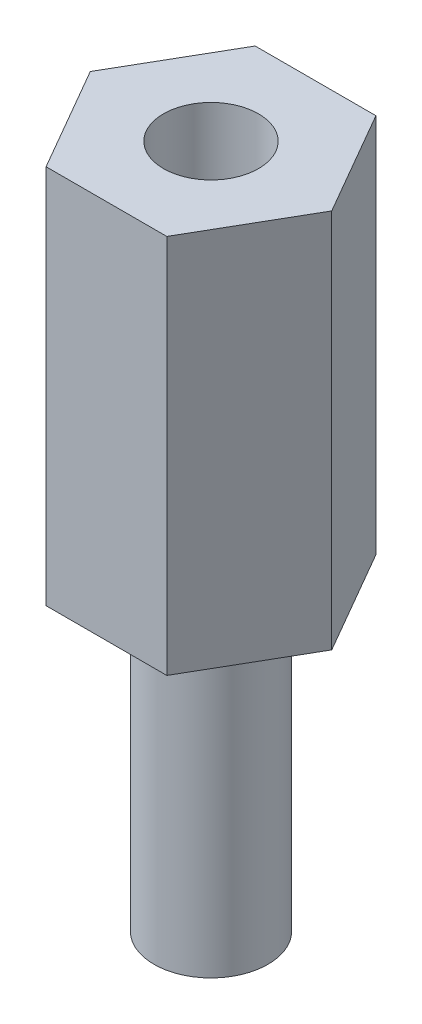
ISO-10303-21;
HEADER;
FILE_DESCRIPTION(('STEP AP214'),'2;1');
FILE_NAME('part.step','',(''),(''),'','','');
FILE_SCHEMA(('AUTOMOTIVE_DESIGN { 1 0 10303 214 1 1 1 1 }'));
ENDSEC;
DATA;
#1=APPLICATION_CONTEXT('core data for automotive mechanical design processes');
#2=APPLICATION_PROTOCOL_DEFINITION('international standard','automotive_design',2000,#1);
#3=PRODUCT_CONTEXT('',#1,'mechanical');
#4=PRODUCT('Part','Part','',(#3));
#5=PRODUCT_RELATED_PRODUCT_CATEGORY('part','',(#4));
#6=PRODUCT_DEFINITION_FORMATION('','',#4);
#7=PRODUCT_DEFINITION_CONTEXT('part definition',#1,'design');
#8=PRODUCT_DEFINITION('design','',#6,#7);
#9=PRODUCT_DEFINITION_SHAPE('','',#8);
#10=(LENGTH_UNIT() NAMED_UNIT(*) SI_UNIT(.MILLI.,.METRE.));
#11=(NAMED_UNIT(*) PLANE_ANGLE_UNIT() SI_UNIT($,.RADIAN.));
#12=(NAMED_UNIT(*) SI_UNIT($,.STERADIAN.) SOLID_ANGLE_UNIT());
#13=UNCERTAINTY_MEASURE_WITH_UNIT(LENGTH_MEASURE(1.E-05),#10,'distance_accuracy_value','');
#14=(GEOMETRIC_REPRESENTATION_CONTEXT(3) GLOBAL_UNCERTAINTY_ASSIGNED_CONTEXT((#13)) GLOBAL_UNIT_ASSIGNED_CONTEXT((#10,
#11,#12)) REPRESENTATION_CONTEXT('',''));
#15=CARTESIAN_POINT('',(0.,0.,0.));
#16=DIRECTION('',(0.,0.,1.));
#17=DIRECTION('',(1.,0.,0.));
#18=AXIS2_PLACEMENT_3D('',#15,#16,#17);
#19=CARTESIAN_POINT('',(1.5877132402715,5.,2.74999999999997));
#20=DIRECTION('',(-0.866025403784442,0.,-0.499999999999995));
#21=DIRECTION('',(-0.499999999999995,0.,0.866025403784442));
#22=AXIS2_PLACEMENT_3D('',#19,#20,#21);
#23=PLANE('',#22);
#24=DIRECTION('',(0.499999999999995,0.,-0.866025403784441));
#25=VECTOR('',#24,1.);
#26=CARTESIAN_POINT('',(1.5877132402715,-5.,2.74999999999997));
#27=LINE('',#26,#25);
#28=CARTESIAN_POINT('',(1.5877132402715,-5.,2.74999999999997));
#29=VERTEX_POINT('',#28);
#30=CARTESIAN_POINT('',(3.17542648054293,-5.,0.));
#31=VERTEX_POINT('',#30);
#32=EDGE_CURVE('E134',#29,#31,#27,.T.);
#33=ORIENTED_EDGE('',*,*,#32,.T.);
#34=DIRECTION('',(0.,-1.,0.));
#35=VECTOR('',#34,1.);
#36=CARTESIAN_POINT('',(3.17542648054293,5.,0.));
#37=LINE('',#36,#35);
#38=CARTESIAN_POINT('',(3.17542648054293,5.,0.));
#39=VERTEX_POINT('',#38);
#40=EDGE_CURVE('E46',#39,#31,#37,.T.);
#41=ORIENTED_EDGE('',*,*,#40,.F.);
#42=DIRECTION('',(0.499999999999995,0.,-0.866025403784441));
#43=VECTOR('',#42,1.);
#44=CARTESIAN_POINT('',(1.5877132402715,5.,2.74999999999997));
#45=LINE('',#44,#43);
#46=CARTESIAN_POINT('',(1.5877132402715,5.,2.74999999999997));
#47=VERTEX_POINT('',#46);
#48=EDGE_CURVE('E151',#47,#39,#45,.T.);
#49=ORIENTED_EDGE('',*,*,#48,.F.);
#50=DIRECTION('',(0.,-1.,0.));
#51=VECTOR('',#50,1.);
#52=CARTESIAN_POINT('',(1.5877132402715,5.,2.74999999999997));
#53=LINE('',#52,#51);
#54=EDGE_CURVE('E130',#47,#29,#53,.T.);
#55=ORIENTED_EDGE('',*,*,#54,.T.);
#56=EDGE_LOOP('',(#33,#41,#49,#55));
#57=FACE_BOUND('',#56,.T.);
#58=ADVANCED_FACE('F43',(#57),#23,.F.);
#59=CARTESIAN_POINT('',(3.17542648054293,5.,0.));
#60=DIRECTION('',(-0.866025403784438,0.,0.500000000000001));
#61=DIRECTION('',(0.500000000000001,0.,0.866025403784438));
#62=AXIS2_PLACEMENT_3D('',#59,#60,#61);
#63=PLANE('',#62);
#64=DIRECTION('',(-0.500000000000001,0.,-0.866025403784438));
#65=VECTOR('',#64,1.);
#66=CARTESIAN_POINT('',(3.17542648054293,-5.,0.));
#67=LINE('',#66,#65);
#68=CARTESIAN_POINT('',(1.58771324027146,-5.,-2.74999999999999));
#69=VERTEX_POINT('',#68);
#70=EDGE_CURVE('E138',#31,#69,#67,.T.);
#71=ORIENTED_EDGE('',*,*,#70,.T.);
#72=DIRECTION('',(0.,-1.,0.));
#73=VECTOR('',#72,1.);
#74=CARTESIAN_POINT('',(1.58771324027146,5.,-2.74999999999999));
#75=LINE('',#74,#73);
#76=CARTESIAN_POINT('',(1.58771324027146,5.,-2.74999999999999));
#77=VERTEX_POINT('',#76);
#78=EDGE_CURVE('E157',#77,#69,#75,.T.);
#79=ORIENTED_EDGE('',*,*,#78,.F.);
#80=DIRECTION('',(-0.500000000000001,0.,-0.866025403784438));
#81=VECTOR('',#80,1.);
#82=CARTESIAN_POINT('',(3.17542648054293,5.,0.));
#83=LINE('',#82,#81);
#84=EDGE_CURVE('E99',#39,#77,#83,.T.);
#85=ORIENTED_EDGE('',*,*,#84,.F.);
#86=ORIENTED_EDGE('',*,*,#40,.T.);
#87=EDGE_LOOP('',(#71,#79,#85,#86));
#88=FACE_BOUND('',#87,.T.);
#89=ADVANCED_FACE('F164',(#88),#63,.F.);
#90=CARTESIAN_POINT('',(1.58771324027146,5.,-2.74999999999999));
#91=DIRECTION('',(0.,0.,1.));
#92=DIRECTION('',(1.,0.,0.));
#93=AXIS2_PLACEMENT_3D('',#90,#91,#92);
#94=PLANE('',#93);
#95=DIRECTION('',(-1.,0.,0.));
#96=VECTOR('',#95,1.);
#97=CARTESIAN_POINT('',(1.58771324027146,-5.,-2.74999999999999));
#98=LINE('',#97,#96);
#99=CARTESIAN_POINT('',(-1.58771324027148,-5.,-2.74999999999998));
#100=VERTEX_POINT('',#99);
#101=EDGE_CURVE('E142',#69,#100,#98,.T.);
#102=ORIENTED_EDGE('',*,*,#101,.T.);
#103=DIRECTION('',(0.,-1.,0.));
#104=VECTOR('',#103,1.);
#105=CARTESIAN_POINT('',(-1.58771324027148,5.,-2.74999999999998));
#106=LINE('',#105,#104);
#107=CARTESIAN_POINT('',(-1.58771324027148,5.,-2.74999999999998));
#108=VERTEX_POINT('',#107);
#109=EDGE_CURVE('E123',#108,#100,#106,.T.);
#110=ORIENTED_EDGE('',*,*,#109,.F.);
#111=DIRECTION('',(-1.,0.,0.));
#112=VECTOR('',#111,1.);
#113=CARTESIAN_POINT('',(1.58771324027146,5.,-2.74999999999999));
#114=LINE('',#113,#112);
#115=EDGE_CURVE('E112',#77,#108,#114,.T.);
#116=ORIENTED_EDGE('',*,*,#115,.F.);
#117=ORIENTED_EDGE('',*,*,#78,.T.);
#118=EDGE_LOOP('',(#102,#110,#116,#117));
#119=FACE_BOUND('',#118,.T.);
#120=ADVANCED_FACE('F170',(#119),#94,.F.);
#121=CARTESIAN_POINT('',(-1.58771324027148,5.,-2.74999999999998));
#122=DIRECTION('',(0.866025403784442,0.,0.499999999999995));
#123=DIRECTION('',(0.499999999999995,0.,-0.866025403784442));
#124=AXIS2_PLACEMENT_3D('',#121,#122,#123);
#125=PLANE('',#124);
#126=DIRECTION('',(-0.499999999999995,0.,0.866025403784441));
#127=VECTOR('',#126,1.);
#128=CARTESIAN_POINT('',(-1.58771324027148,-5.,-2.74999999999998));
#129=LINE('',#128,#127);
#130=CARTESIAN_POINT('',(-3.17542648054293,-5.,0.));
#131=VERTEX_POINT('',#130);
#132=EDGE_CURVE('E121',#100,#131,#129,.T.);
#133=ORIENTED_EDGE('',*,*,#132,.T.);
#134=DIRECTION('',(0.,-1.,0.));
#135=VECTOR('',#134,1.);
#136=CARTESIAN_POINT('',(-3.17542648054293,5.,0.));
#137=LINE('',#136,#135);
#138=CARTESIAN_POINT('',(-3.17542648054293,5.,0.));
#139=VERTEX_POINT('',#138);
#140=EDGE_CURVE('E118',#139,#131,#137,.T.);
#141=ORIENTED_EDGE('',*,*,#140,.F.);
#142=DIRECTION('',(-0.499999999999995,0.,0.866025403784441));
#143=VECTOR('',#142,1.);
#144=CARTESIAN_POINT('',(-1.58771324027148,5.,-2.74999999999998));
#145=LINE('',#144,#143);
#146=EDGE_CURVE('E106',#108,#139,#145,.T.);
#147=ORIENTED_EDGE('',*,*,#146,.F.);
#148=ORIENTED_EDGE('',*,*,#109,.T.);
#149=EDGE_LOOP('',(#133,#141,#147,#148));
#150=FACE_BOUND('',#149,.T.);
#151=ADVANCED_FACE('F119',(#150),#125,.F.);
#152=CARTESIAN_POINT('',(-3.17542648054293,5.,0.));
#153=DIRECTION('',(0.866025403784435,0.,-0.500000000000007));
#154=DIRECTION('',(-0.500000000000007,0.,-0.866025403784435));
#155=AXIS2_PLACEMENT_3D('',#152,#153,#154);
#156=PLANE('',#155);
#157=DIRECTION('',(0.500000000000007,0.,0.866025403784435));
#158=VECTOR('',#157,1.);
#159=CARTESIAN_POINT('',(-3.17542648054293,-5.,0.));
#160=LINE('',#159,#158);
#161=CARTESIAN_POINT('',(-1.58771324027144,-5.,2.75000000000001));
#162=VERTEX_POINT('',#161);
#163=EDGE_CURVE('E84',#131,#162,#160,.T.);
#164=ORIENTED_EDGE('',*,*,#163,.T.);
#165=DIRECTION('',(0.,-1.,0.));
#166=VECTOR('',#165,1.);
#167=CARTESIAN_POINT('',(-1.58771324027144,5.,2.75000000000001));
#168=LINE('',#167,#166);
#169=CARTESIAN_POINT('',(-1.58771324027144,5.,2.75000000000001));
#170=VERTEX_POINT('',#169);
#171=EDGE_CURVE('E124',#170,#162,#168,.T.);
#172=ORIENTED_EDGE('',*,*,#171,.F.);
#173=DIRECTION('',(0.500000000000007,0.,0.866025403784435));
#174=VECTOR('',#173,1.);
#175=CARTESIAN_POINT('',(-3.17542648054293,5.,0.));
#176=LINE('',#175,#174);
#177=EDGE_CURVE('E110',#139,#170,#176,.T.);
#178=ORIENTED_EDGE('',*,*,#177,.F.);
#179=ORIENTED_EDGE('',*,*,#140,.T.);
#180=EDGE_LOOP('',(#164,#172,#178,#179));
#181=FACE_BOUND('',#180,.T.);
#182=ADVANCED_FACE('F126',(#181),#156,.F.);
#183=CARTESIAN_POINT('',(-1.58771324027144,5.,2.75000000000001));
#184=DIRECTION('',(0.,0.,-1.));
#185=DIRECTION('',(-1.,0.,0.));
#186=AXIS2_PLACEMENT_3D('',#183,#184,#185);
#187=PLANE('',#186);
#188=DIRECTION('',(1.,0.,0.));
#189=VECTOR('',#188,1.);
#190=CARTESIAN_POINT('',(-1.58771324027144,-5.,2.75000000000001));
#191=LINE('',#190,#189);
#192=EDGE_CURVE('E90',#162,#29,#191,.T.);
#193=ORIENTED_EDGE('',*,*,#192,.T.);
#194=ORIENTED_EDGE('',*,*,#54,.F.);
#195=DIRECTION('',(1.,0.,0.));
#196=VECTOR('',#195,1.);
#197=CARTESIAN_POINT('',(-1.58771324027144,5.,2.75000000000001));
#198=LINE('',#197,#196);
#199=EDGE_CURVE('E61',#170,#47,#198,.T.);
#200=ORIENTED_EDGE('',*,*,#199,.F.);
#201=ORIENTED_EDGE('',*,*,#171,.T.);
#202=EDGE_LOOP('',(#193,#194,#200,#201));
#203=FACE_BOUND('',#202,.T.);
#204=ADVANCED_FACE('F207',(#203),#187,.F.);
#205=CARTESIAN_POINT('',(0.,5.,0.));
#206=DIRECTION('',(0.,1.,0.));
#207=DIRECTION('',(0.,0.,1.));
#208=AXIS2_PLACEMENT_3D('',#205,#206,#207);
#209=PLANE('',#208);
#210=CARTESIAN_POINT('',(0.,5.,0.));
#211=DIRECTION('',(0.,1.,0.));
#212=DIRECTION('',(0.,0.,1.));
#213=AXIS2_PLACEMENT_3D('',#210,#211,#212);
#214=CIRCLE('',#213,1.24999999999999);
#215=CARTESIAN_POINT('',(0.,5.,1.24999999999999));
#216=VERTEX_POINT('',#215);
#217=EDGE_CURVE('E177',#216,#216,#214,.T.);
#218=ORIENTED_EDGE('',*,*,#217,.F.);
#219=EDGE_LOOP('',(#218));
#220=FACE_BOUND('',#219,.T.);
#221=ORIENTED_EDGE('',*,*,#48,.T.);
#222=ORIENTED_EDGE('',*,*,#84,.T.);
#223=ORIENTED_EDGE('',*,*,#115,.T.);
#224=ORIENTED_EDGE('',*,*,#146,.T.);
#225=ORIENTED_EDGE('',*,*,#177,.T.);
#226=ORIENTED_EDGE('',*,*,#199,.T.);
#227=EDGE_LOOP('',(#221,#222,#223,#224,#225,#226));
#228=FACE_BOUND('',#227,.T.);
#229=ADVANCED_FACE('F108',(#220,#228),#209,.T.);
#230=CARTESIAN_POINT('',(0.,-5.,0.));
#231=DIRECTION('',(0.,1.,0.));
#232=DIRECTION('',(0.,0.,1.));
#233=AXIS2_PLACEMENT_3D('',#230,#231,#232);
#234=PLANE('',#233);
#235=CARTESIAN_POINT('',(0.,-5.,0.));
#236=DIRECTION('',(0.,-1.,0.));
#237=DIRECTION('',(0.,0.,-1.));
#238=AXIS2_PLACEMENT_3D('',#235,#236,#237);
#239=CIRCLE('',#238,1.5);
#240=CARTESIAN_POINT('',(0.,-5.,-1.5));
#241=VERTEX_POINT('',#240);
#242=EDGE_CURVE('E11',#241,#241,#239,.T.);
#243=ORIENTED_EDGE('',*,*,#242,.F.);
#244=EDGE_LOOP('',(#243));
#245=FACE_BOUND('',#244,.T.);
#246=ORIENTED_EDGE('',*,*,#32,.F.);
#247=ORIENTED_EDGE('',*,*,#192,.F.);
#248=ORIENTED_EDGE('',*,*,#163,.F.);
#249=ORIENTED_EDGE('',*,*,#132,.F.);
#250=ORIENTED_EDGE('',*,*,#101,.F.);
#251=ORIENTED_EDGE('',*,*,#70,.F.);
#252=EDGE_LOOP('',(#246,#247,#248,#249,#250,#251));
#253=FACE_BOUND('',#252,.T.);
#254=ADVANCED_FACE('F169',(#245,#253),#234,.F.);
#255=CARTESIAN_POINT('',(0.,5.,0.));
#256=DIRECTION('',(0.,1.,0.));
#257=DIRECTION('',(0.,0.,1.));
#258=AXIS2_PLACEMENT_3D('',#255,#256,#257);
#259=CYLINDRICAL_SURFACE('',#258,1.24999999999999);
#260=CARTESIAN_POINT('',(0.,0.,0.));
#261=DIRECTION('',(0.,1.,0.));
#262=DIRECTION('',(0.,0.,1.));
#263=AXIS2_PLACEMENT_3D('',#260,#261,#262);
#264=CIRCLE('',#263,1.24999999999999);
#265=CARTESIAN_POINT('',(0.,0.,1.24999999999999));
#266=VERTEX_POINT('',#265);
#267=EDGE_CURVE('E139',#266,#266,#264,.F.);
#268=ORIENTED_EDGE('',*,*,#267,.T.);
#269=EDGE_LOOP('',(#268));
#270=FACE_BOUND('',#269,.T.);
#271=ORIENTED_EDGE('',*,*,#217,.T.);
#272=EDGE_LOOP('',(#271));
#273=FACE_BOUND('',#272,.T.);
#274=ADVANCED_FACE('F199',(#270,#273),#259,.F.);
#275=CARTESIAN_POINT('',(-400000.,0.,291596.975));
#276=DIRECTION('',(0.,1.,0.));
#277=DIRECTION('',(0.,0.,1.));
#278=AXIS2_PLACEMENT_3D('',#275,#276,#277);
#279=PLANE('',#278);
#280=ORIENTED_EDGE('',*,*,#267,.F.);
#281=EDGE_LOOP('',(#280));
#282=FACE_BOUND('',#281,.T.);
#283=ADVANCED_FACE('F194',(#282),#279,.T.);
#284=CARTESIAN_POINT('',(0.,-13.,0.));
#285=DIRECTION('',(0.,1.,0.));
#286=DIRECTION('',(0.,0.,1.));
#287=AXIS2_PLACEMENT_3D('',#284,#285,#286);
#288=CYLINDRICAL_SURFACE('',#287,1.5);
#289=CARTESIAN_POINT('',(0.,-13.,0.));
#290=DIRECTION('',(0.,-1.,0.));
#291=DIRECTION('',(0.,0.,-1.));
#292=AXIS2_PLACEMENT_3D('',#289,#290,#291);
#293=CIRCLE('',#292,1.5);
#294=CARTESIAN_POINT('',(0.,-13.,-1.5));
#295=VERTEX_POINT('',#294);
#296=EDGE_CURVE('E181',#295,#295,#293,.T.);
#297=ORIENTED_EDGE('',*,*,#296,.F.);
#298=EDGE_LOOP('',(#297));
#299=FACE_BOUND('',#298,.T.);
#300=ORIENTED_EDGE('',*,*,#242,.T.);
#301=EDGE_LOOP('',(#300));
#302=FACE_BOUND('',#301,.T.);
#303=ADVANCED_FACE('F191',(#299,#302),#288,.T.);
#304=CARTESIAN_POINT('',(0.,-13.,0.));
#305=DIRECTION('',(0.,-1.,0.));
#306=DIRECTION('',(0.,0.,-1.));
#307=AXIS2_PLACEMENT_3D('',#304,#305,#306);
#308=PLANE('',#307);
#309=ORIENTED_EDGE('',*,*,#296,.T.);
#310=EDGE_LOOP('',(#309));
#311=FACE_BOUND('',#310,.T.);
#312=ADVANCED_FACE('F189',(#311),#308,.T.);
#313=CLOSED_SHELL('',(#58,#89,#120,#151,#182,#204,#229,#254,#274,#283,#303,#312));
#314=MANIFOLD_SOLID_BREP('B2',#313);
#315=ADVANCED_BREP_SHAPE_REPRESENTATION('',(#18,#314),#14);
#316=SHAPE_DEFINITION_REPRESENTATION(#9,#315);
ENDSEC;
END-ISO-10303-21;
